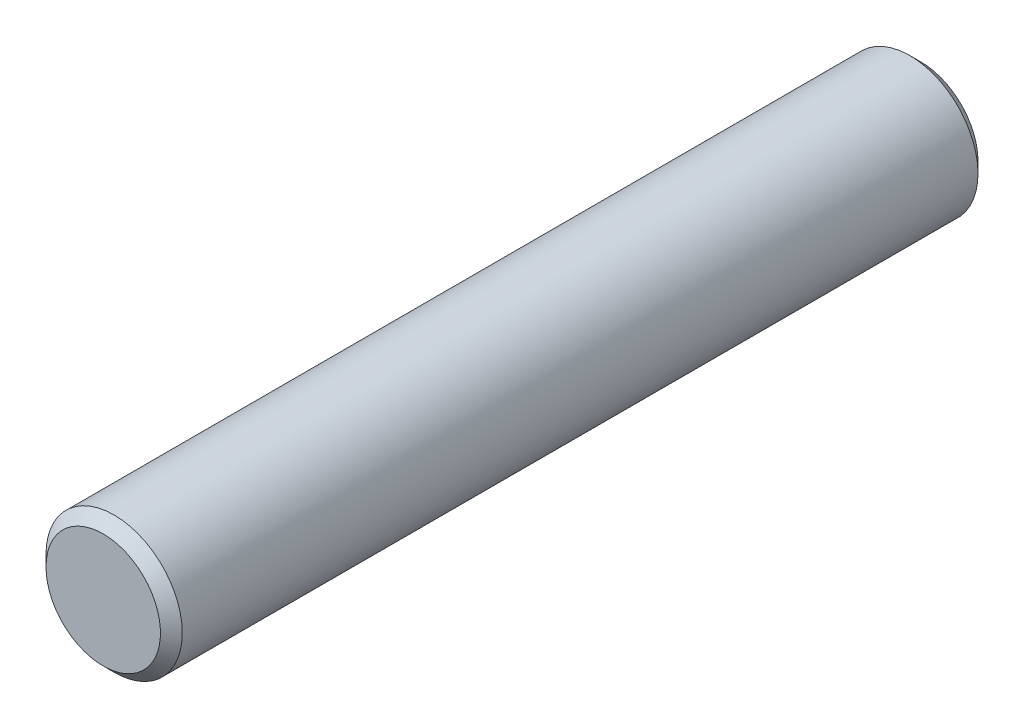
ISO-10303-21;
HEADER;
FILE_DESCRIPTION(('STEP AP214'),'2;1');
FILE_NAME('part.step','',(''),(''),'','','');
FILE_SCHEMA(('AUTOMOTIVE_DESIGN { 1 0 10303 214 1 1 1 1 }'));
ENDSEC;
DATA;
#1=APPLICATION_CONTEXT('core data for automotive mechanical design processes');
#2=APPLICATION_PROTOCOL_DEFINITION('international standard','automotive_design',2000,#1);
#3=PRODUCT_CONTEXT('',#1,'mechanical');
#4=PRODUCT('Part','Part','',(#3));
#5=PRODUCT_RELATED_PRODUCT_CATEGORY('part','',(#4));
#6=PRODUCT_DEFINITION_FORMATION('','',#4);
#7=PRODUCT_DEFINITION_CONTEXT('part definition',#1,'design');
#8=PRODUCT_DEFINITION('design','',#6,#7);
#9=PRODUCT_DEFINITION_SHAPE('','',#8);
#10=(LENGTH_UNIT() NAMED_UNIT(*) SI_UNIT(.MILLI.,.METRE.));
#11=(NAMED_UNIT(*) PLANE_ANGLE_UNIT() SI_UNIT($,.RADIAN.));
#12=(NAMED_UNIT(*) SI_UNIT($,.STERADIAN.) SOLID_ANGLE_UNIT());
#13=UNCERTAINTY_MEASURE_WITH_UNIT(LENGTH_MEASURE(1.E-05),#10,'distance_accuracy_value','');
#14=(GEOMETRIC_REPRESENTATION_CONTEXT(3) GLOBAL_UNCERTAINTY_ASSIGNED_CONTEXT((#13)) GLOBAL_UNIT_ASSIGNED_CONTEXT((#10,
#11,#12)) REPRESENTATION_CONTEXT('',''));
#15=CARTESIAN_POINT('',(0.,0.,0.));
#16=DIRECTION('',(0.,0.,1.));
#17=DIRECTION('',(1.,0.,0.));
#18=AXIS2_PLACEMENT_3D('',#15,#16,#17);
#19=CARTESIAN_POINT('',(0.,2.5,15.));
#20=DIRECTION('',(0.,0.,-1.));
#21=DIRECTION('',(-1.,0.,0.));
#22=AXIS2_PLACEMENT_3D('',#19,#20,#21);
#23=PLANE('',#22);
#24=CARTESIAN_POINT('',(0.,0.,15.));
#25=DIRECTION('',(0.,0.,-1.));
#26=DIRECTION('',(-1.,0.,0.));
#27=AXIS2_PLACEMENT_3D('',#24,#25,#26);
#28=CIRCLE('',#27,2.1);
#29=CARTESIAN_POINT('',(-2.1,0.,15.));
#30=VERTEX_POINT('',#29);
#31=EDGE_CURVE('E10',#30,#30,#28,.F.);
#32=ORIENTED_EDGE('',*,*,#31,.T.);
#33=EDGE_LOOP('',(#32));
#34=FACE_BOUND('',#33,.T.);
#35=ADVANCED_FACE('F45',(#34),#23,.F.);
#36=CARTESIAN_POINT('',(0.,2.50000000000001,-15.));
#37=DIRECTION('',(0.,0.,1.));
#38=DIRECTION('',(1.,0.,0.));
#39=AXIS2_PLACEMENT_3D('',#36,#37,#38);
#40=PLANE('',#39);
#41=CARTESIAN_POINT('',(0.,0.,-15.));
#42=DIRECTION('',(0.,0.,1.));
#43=DIRECTION('',(1.,0.,0.));
#44=AXIS2_PLACEMENT_3D('',#41,#42,#43);
#45=CIRCLE('',#44,2.10000000000001);
#46=CARTESIAN_POINT('',(2.10000000000001,0.,-15.));
#47=VERTEX_POINT('',#46);
#48=EDGE_CURVE('E53',#47,#47,#45,.F.);
#49=ORIENTED_EDGE('',*,*,#48,.T.);
#50=EDGE_LOOP('',(#49));
#51=FACE_BOUND('',#50,.T.);
#52=ADVANCED_FACE('F77',(#51),#40,.F.);
#53=CARTESIAN_POINT('',(0.,0.,12.3614958448753));
#54=DIRECTION('',(0.,0.,1.));
#55=DIRECTION('',(1.,0.,0.));
#56=AXIS2_PLACEMENT_3D('',#53,#54,#55);
#57=CYLINDRICAL_SURFACE('',#56,2.5);
#58=CARTESIAN_POINT('',(0.,0.,-14.6));
#59=DIRECTION('',(0.,0.,1.));
#60=DIRECTION('',(1.,0.,0.));
#61=AXIS2_PLACEMENT_3D('',#58,#59,#60);
#62=CIRCLE('',#61,2.5);
#63=CARTESIAN_POINT('',(2.5,0.,-14.6));
#64=VERTEX_POINT('',#63);
#65=EDGE_CURVE('E57',#64,#64,#62,.T.);
#66=ORIENTED_EDGE('',*,*,#65,.T.);
#67=EDGE_LOOP('',(#66));
#68=FACE_BOUND('',#67,.T.);
#69=CARTESIAN_POINT('',(0.,0.,14.6));
#70=DIRECTION('',(0.,0.,-1.));
#71=DIRECTION('',(-1.,0.,0.));
#72=AXIS2_PLACEMENT_3D('',#69,#70,#71);
#73=CIRCLE('',#72,2.5);
#74=CARTESIAN_POINT('',(-2.5,0.,14.6));
#75=VERTEX_POINT('',#74);
#76=EDGE_CURVE('E61',#75,#75,#73,.T.);
#77=ORIENTED_EDGE('',*,*,#76,.T.);
#78=EDGE_LOOP('',(#77));
#79=FACE_BOUND('',#78,.T.);
#80=ADVANCED_FACE('F67',(#68,#79),#57,.T.);
#81=CARTESIAN_POINT('',(0.,0.,-14.6));
#82=DIRECTION('',(0.,0.,1.));
#83=DIRECTION('',(1.,0.,0.));
#84=AXIS2_PLACEMENT_3D('',#81,#82,#83);
#85=CONICAL_SURFACE('',#84,2.5,0.785398163397449);
#86=ORIENTED_EDGE('',*,*,#48,.F.);
#87=EDGE_LOOP('',(#86));
#88=FACE_BOUND('',#87,.T.);
#89=ORIENTED_EDGE('',*,*,#65,.F.);
#90=EDGE_LOOP('',(#89));
#91=FACE_BOUND('',#90,.T.);
#92=ADVANCED_FACE('F71',(#88,#91),#85,.T.);
#93=CARTESIAN_POINT('',(0.,0.,15.));
#94=DIRECTION('',(0.,0.,-1.));
#95=DIRECTION('',(-1.,0.,0.));
#96=AXIS2_PLACEMENT_3D('',#93,#94,#95);
#97=CONICAL_SURFACE('',#96,2.1,0.785398163397449);
#98=ORIENTED_EDGE('',*,*,#76,.F.);
#99=EDGE_LOOP('',(#98));
#100=FACE_BOUND('',#99,.T.);
#101=ORIENTED_EDGE('',*,*,#31,.F.);
#102=EDGE_LOOP('',(#101));
#103=FACE_BOUND('',#102,.T.);
#104=ADVANCED_FACE('F48',(#100,#103),#97,.T.);
#105=CLOSED_SHELL('',(#35,#52,#80,#92,#104));
#106=MANIFOLD_SOLID_BREP('B2',#105);
#107=ADVANCED_BREP_SHAPE_REPRESENTATION('',(#18,#106),#14);
#108=SHAPE_DEFINITION_REPRESENTATION(#9,#107);
ENDSEC;
END-ISO-10303-21;
